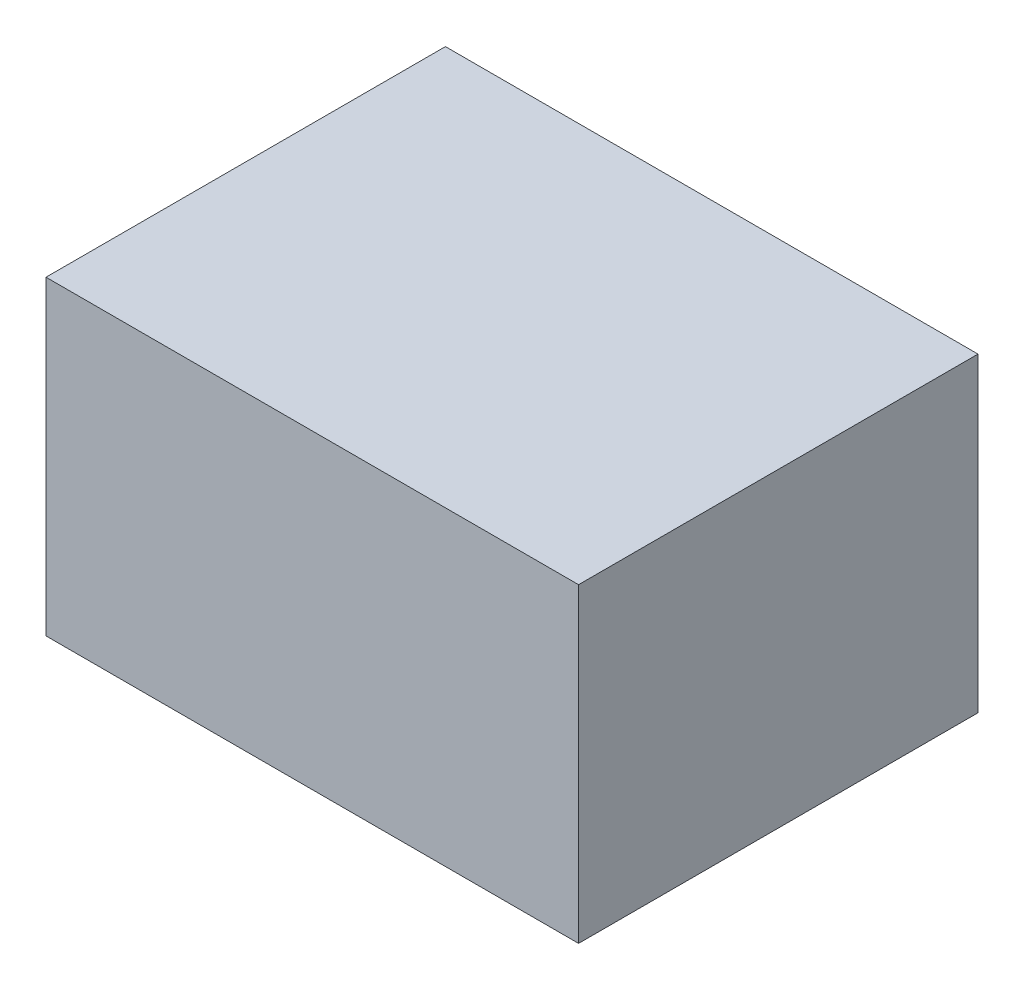
ISO-10303-21;
HEADER;
FILE_DESCRIPTION(('STEP AP214'),'2;1');
FILE_NAME('part.step','',(''),(''),'','','');
FILE_SCHEMA(('AUTOMOTIVE_DESIGN { 1 0 10303 214 1 1 1 1 }'));
ENDSEC;
DATA;
#1=APPLICATION_CONTEXT('core data for automotive mechanical design processes');
#2=APPLICATION_PROTOCOL_DEFINITION('international standard','automotive_design',2000,#1);
#3=PRODUCT_CONTEXT('',#1,'mechanical');
#4=PRODUCT('Part','Part','',(#3));
#5=PRODUCT_RELATED_PRODUCT_CATEGORY('part','',(#4));
#6=PRODUCT_DEFINITION_FORMATION('','',#4);
#7=PRODUCT_DEFINITION_CONTEXT('part definition',#1,'design');
#8=PRODUCT_DEFINITION('design','',#6,#7);
#9=PRODUCT_DEFINITION_SHAPE('','',#8);
#10=(LENGTH_UNIT() NAMED_UNIT(*) SI_UNIT(.MILLI.,.METRE.));
#11=(NAMED_UNIT(*) PLANE_ANGLE_UNIT() SI_UNIT($,.RADIAN.));
#12=(NAMED_UNIT(*) SI_UNIT($,.STERADIAN.) SOLID_ANGLE_UNIT());
#13=UNCERTAINTY_MEASURE_WITH_UNIT(LENGTH_MEASURE(1.E-05),#10,'distance_accuracy_value','');
#14=(GEOMETRIC_REPRESENTATION_CONTEXT(3) GLOBAL_UNCERTAINTY_ASSIGNED_CONTEXT((#13)) GLOBAL_UNIT_ASSIGNED_CONTEXT((#10,
#11,#12)) REPRESENTATION_CONTEXT('',''));
#15=CARTESIAN_POINT('',(0.,0.,0.));
#16=DIRECTION('',(0.,0.,1.));
#17=DIRECTION('',(1.,0.,0.));
#18=AXIS2_PLACEMENT_3D('',#15,#16,#17);
#19=CARTESIAN_POINT('',(152.4,177.8,-114.3));
#20=DIRECTION('',(-1.,0.,0.));
#21=DIRECTION('',(0.,0.,1.));
#22=AXIS2_PLACEMENT_3D('',#19,#20,#21);
#23=PLANE('',#22);
#24=DIRECTION('',(0.,0.,-1.));
#25=VECTOR('',#24,1.);
#26=CARTESIAN_POINT('',(152.4,0.,-114.3));
#27=LINE('',#26,#25);
#28=CARTESIAN_POINT('',(152.4,0.,114.3));
#29=VERTEX_POINT('',#28);
#30=CARTESIAN_POINT('',(152.4,0.,-114.3));
#31=VERTEX_POINT('',#30);
#32=EDGE_CURVE('E97',#29,#31,#27,.T.);
#33=ORIENTED_EDGE('',*,*,#32,.T.);
#34=DIRECTION('',(0.,-1.,0.));
#35=VECTOR('',#34,1.);
#36=CARTESIAN_POINT('',(152.4,177.8,-114.3));
#37=LINE('',#36,#35);
#38=CARTESIAN_POINT('',(152.4,177.8,-114.3));
#39=VERTEX_POINT('',#38);
#40=EDGE_CURVE('E11',#39,#31,#37,.T.);
#41=ORIENTED_EDGE('',*,*,#40,.F.);
#42=DIRECTION('',(0.,0.,-1.));
#43=VECTOR('',#42,1.);
#44=CARTESIAN_POINT('',(152.4,177.8,-114.3));
#45=LINE('',#44,#43);
#46=CARTESIAN_POINT('',(152.4,177.8,114.3));
#47=VERTEX_POINT('',#46);
#48=EDGE_CURVE('E85',#47,#39,#45,.T.);
#49=ORIENTED_EDGE('',*,*,#48,.F.);
#50=DIRECTION('',(0.,-1.,0.));
#51=VECTOR('',#50,1.);
#52=CARTESIAN_POINT('',(152.4,177.8,114.3));
#53=LINE('',#52,#51);
#54=EDGE_CURVE('E93',#47,#29,#53,.T.);
#55=ORIENTED_EDGE('',*,*,#54,.T.);
#56=EDGE_LOOP('',(#33,#41,#49,#55));
#57=FACE_BOUND('',#56,.T.);
#58=ADVANCED_FACE('F34',(#57),#23,.F.);
#59=CARTESIAN_POINT('',(-152.4,177.8,-114.3));
#60=DIRECTION('',(0.,0.,1.));
#61=DIRECTION('',(1.,0.,0.));
#62=AXIS2_PLACEMENT_3D('',#59,#60,#61);
#63=PLANE('',#62);
#64=DIRECTION('',(-1.,0.,0.));
#65=VECTOR('',#64,1.);
#66=CARTESIAN_POINT('',(-152.4,0.,-114.3));
#67=LINE('',#66,#65);
#68=CARTESIAN_POINT('',(-152.4,0.,-114.3));
#69=VERTEX_POINT('',#68);
#70=EDGE_CURVE('E89',#31,#69,#67,.T.);
#71=ORIENTED_EDGE('',*,*,#70,.T.);
#72=DIRECTION('',(0.,-1.,0.));
#73=VECTOR('',#72,1.);
#74=CARTESIAN_POINT('',(-152.4,177.8,-114.3));
#75=LINE('',#74,#73);
#76=CARTESIAN_POINT('',(-152.4,177.8,-114.3));
#77=VERTEX_POINT('',#76);
#78=EDGE_CURVE('E42',#77,#69,#75,.T.);
#79=ORIENTED_EDGE('',*,*,#78,.F.);
#80=DIRECTION('',(-1.,0.,0.));
#81=VECTOR('',#80,1.);
#82=CARTESIAN_POINT('',(-152.4,177.8,-114.3));
#83=LINE('',#82,#81);
#84=EDGE_CURVE('E80',#39,#77,#83,.T.);
#85=ORIENTED_EDGE('',*,*,#84,.F.);
#86=ORIENTED_EDGE('',*,*,#40,.T.);
#87=EDGE_LOOP('',(#71,#79,#85,#86));
#88=FACE_BOUND('',#87,.T.);
#89=ADVANCED_FACE('F88',(#88),#63,.F.);
#90=CARTESIAN_POINT('',(-152.4,177.8,-114.3));
#91=DIRECTION('',(1.,0.,0.));
#92=DIRECTION('',(0.,0.,-1.));
#93=AXIS2_PLACEMENT_3D('',#90,#91,#92);
#94=PLANE('',#93);
#95=DIRECTION('',(0.,0.,1.));
#96=VECTOR('',#95,1.);
#97=CARTESIAN_POINT('',(-152.4,0.,-114.3));
#98=LINE('',#97,#96);
#99=CARTESIAN_POINT('',(-152.4,0.,114.3));
#100=VERTEX_POINT('',#99);
#101=EDGE_CURVE('E67',#69,#100,#98,.T.);
#102=ORIENTED_EDGE('',*,*,#101,.T.);
#103=DIRECTION('',(0.,-1.,0.));
#104=VECTOR('',#103,1.);
#105=CARTESIAN_POINT('',(-152.4,177.8,114.3));
#106=LINE('',#105,#104);
#107=CARTESIAN_POINT('',(-152.4,177.8,114.3));
#108=VERTEX_POINT('',#107);
#109=EDGE_CURVE('E90',#108,#100,#106,.T.);
#110=ORIENTED_EDGE('',*,*,#109,.F.);
#111=DIRECTION('',(0.,0.,1.));
#112=VECTOR('',#111,1.);
#113=CARTESIAN_POINT('',(-152.4,177.8,-114.3));
#114=LINE('',#113,#112);
#115=EDGE_CURVE('E83',#77,#108,#114,.T.);
#116=ORIENTED_EDGE('',*,*,#115,.F.);
#117=ORIENTED_EDGE('',*,*,#78,.T.);
#118=EDGE_LOOP('',(#102,#110,#116,#117));
#119=FACE_BOUND('',#118,.T.);
#120=ADVANCED_FACE('F91',(#119),#94,.F.);
#121=CARTESIAN_POINT('',(-152.4,177.8,114.3));
#122=DIRECTION('',(0.,0.,-1.));
#123=DIRECTION('',(-1.,0.,0.));
#124=AXIS2_PLACEMENT_3D('',#121,#122,#123);
#125=PLANE('',#124);
#126=DIRECTION('',(1.,0.,0.));
#127=VECTOR('',#126,1.);
#128=CARTESIAN_POINT('',(-152.4,0.,114.3));
#129=LINE('',#128,#127);
#130=EDGE_CURVE('E73',#100,#29,#129,.T.);
#131=ORIENTED_EDGE('',*,*,#130,.T.);
#132=ORIENTED_EDGE('',*,*,#54,.F.);
#133=DIRECTION('',(1.,0.,0.));
#134=VECTOR('',#133,1.);
#135=CARTESIAN_POINT('',(-152.4,177.8,114.3));
#136=LINE('',#135,#134);
#137=EDGE_CURVE('E50',#108,#47,#136,.T.);
#138=ORIENTED_EDGE('',*,*,#137,.F.);
#139=ORIENTED_EDGE('',*,*,#109,.T.);
#140=EDGE_LOOP('',(#131,#132,#138,#139));
#141=FACE_BOUND('',#140,.T.);
#142=ADVANCED_FACE('F104',(#141),#125,.F.);
#143=CARTESIAN_POINT('',(0.,177.8,0.));
#144=DIRECTION('',(0.,1.,0.));
#145=DIRECTION('',(0.,0.,1.));
#146=AXIS2_PLACEMENT_3D('',#143,#144,#145);
#147=PLANE('',#146);
#148=ORIENTED_EDGE('',*,*,#48,.T.);
#149=ORIENTED_EDGE('',*,*,#84,.T.);
#150=ORIENTED_EDGE('',*,*,#115,.T.);
#151=ORIENTED_EDGE('',*,*,#137,.T.);
#152=EDGE_LOOP('',(#148,#149,#150,#151));
#153=FACE_BOUND('',#152,.T.);
#154=ADVANCED_FACE('F81',(#153),#147,.T.);
#155=CARTESIAN_POINT('',(0.,0.,0.));
#156=DIRECTION('',(0.,1.,0.));
#157=DIRECTION('',(0.,0.,1.));
#158=AXIS2_PLACEMENT_3D('',#155,#156,#157);
#159=PLANE('',#158);
#160=ORIENTED_EDGE('',*,*,#32,.F.);
#161=ORIENTED_EDGE('',*,*,#130,.F.);
#162=ORIENTED_EDGE('',*,*,#101,.F.);
#163=ORIENTED_EDGE('',*,*,#70,.F.);
#164=EDGE_LOOP('',(#160,#161,#162,#163));
#165=FACE_BOUND('',#164,.T.);
#166=ADVANCED_FACE('F107',(#165),#159,.F.);
#167=CLOSED_SHELL('',(#58,#89,#120,#142,#154,#166));
#168=MANIFOLD_SOLID_BREP('B2',#167);
#169=ADVANCED_BREP_SHAPE_REPRESENTATION('',(#18,#168),#14);
#170=SHAPE_DEFINITION_REPRESENTATION(#9,#169);
ENDSEC;
END-ISO-10303-21;
